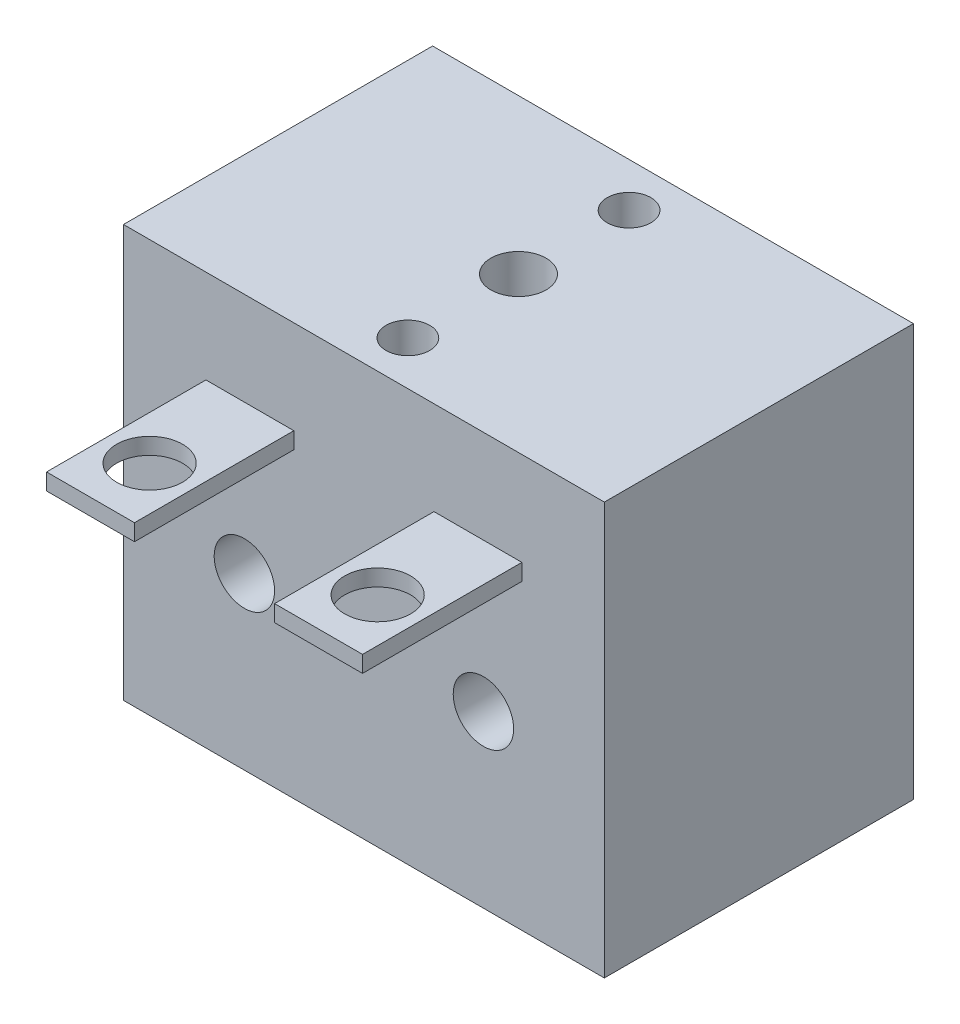
ISO-10303-21;
HEADER;
FILE_DESCRIPTION(('STEP AP214'),'2;1');
FILE_NAME('part.step','',(''),(''),'','','');
FILE_SCHEMA(('AUTOMOTIVE_DESIGN { 1 0 10303 214 1 1 1 1 }'));
ENDSEC;
DATA;
#1=APPLICATION_CONTEXT('core data for automotive mechanical design processes');
#2=APPLICATION_PROTOCOL_DEFINITION('international standard','automotive_design',2000,#1);
#3=PRODUCT_CONTEXT('',#1,'mechanical');
#4=PRODUCT('Part','Part','',(#3));
#5=PRODUCT_RELATED_PRODUCT_CATEGORY('part','',(#4));
#6=PRODUCT_DEFINITION_FORMATION('','',#4);
#7=PRODUCT_DEFINITION_CONTEXT('part definition',#1,'design');
#8=PRODUCT_DEFINITION('design','',#6,#7);
#9=PRODUCT_DEFINITION_SHAPE('','',#8);
#10=(LENGTH_UNIT() NAMED_UNIT(*) SI_UNIT(.MILLI.,.METRE.));
#11=(NAMED_UNIT(*) PLANE_ANGLE_UNIT() SI_UNIT($,.RADIAN.));
#12=(NAMED_UNIT(*) SI_UNIT($,.STERADIAN.) SOLID_ANGLE_UNIT());
#13=UNCERTAINTY_MEASURE_WITH_UNIT(LENGTH_MEASURE(1.E-05),#10,'distance_accuracy_value','');
#14=(GEOMETRIC_REPRESENTATION_CONTEXT(3) GLOBAL_UNCERTAINTY_ASSIGNED_CONTEXT((#13)) GLOBAL_UNIT_ASSIGNED_CONTEXT((#10,
#11,#12)) REPRESENTATION_CONTEXT('',''));
#15=CARTESIAN_POINT('',(0.,0.,0.));
#16=DIRECTION('',(0.,0.,1.));
#17=DIRECTION('',(1.,0.,0.));
#18=AXIS2_PLACEMENT_3D('',#15,#16,#17);
#19=CARTESIAN_POINT('',(0.,38.1,0.));
#20=DIRECTION('',(0.,0.,-1.));
#21=DIRECTION('',(-1.,0.,0.));
#22=AXIS2_PLACEMENT_3D('',#19,#20,#21);
#23=PLANE('',#22);
#24=DIRECTION('',(0.,-1.,0.));
#25=VECTOR('',#24,1.);
#26=CARTESIAN_POINT('',(7.62,29.464,0.));
#27=LINE('',#26,#25);
#28=CARTESIAN_POINT('',(7.62,29.464,0.));
#29=VERTEX_POINT('',#28);
#30=CARTESIAN_POINT('',(7.62,27.94,0.));
#31=VERTEX_POINT('',#30);
#32=EDGE_CURVE('E145',#29,#31,#27,.T.);
#33=ORIENTED_EDGE('',*,*,#32,.F.);
#34=DIRECTION('',(-1.,0.,0.));
#35=VECTOR('',#34,1.);
#36=CARTESIAN_POINT('',(7.62,29.464,0.));
#37=LINE('',#36,#35);
#38=CARTESIAN_POINT('',(15.748,29.464,0.));
#39=VERTEX_POINT('',#38);
#40=EDGE_CURVE('E158',#39,#29,#37,.T.);
#41=ORIENTED_EDGE('',*,*,#40,.F.);
#42=DIRECTION('',(0.,1.,0.));
#43=VECTOR('',#42,1.);
#44=CARTESIAN_POINT('',(15.748,29.464,0.));
#45=LINE('',#44,#43);
#46=CARTESIAN_POINT('',(15.748,27.94,0.));
#47=VERTEX_POINT('',#46);
#48=EDGE_CURVE('E167',#47,#39,#45,.T.);
#49=ORIENTED_EDGE('',*,*,#48,.F.);
#50=DIRECTION('',(1.,0.,0.));
#51=VECTOR('',#50,1.);
#52=CARTESIAN_POINT('',(7.62,27.94,0.));
#53=LINE('',#52,#51);
#54=EDGE_CURVE('E148',#31,#47,#53,.T.);
#55=ORIENTED_EDGE('',*,*,#54,.F.);
#56=EDGE_LOOP('',(#33,#41,#49,#55));
#57=FACE_BOUND('',#56,.T.);
#58=CARTESIAN_POINT('',(11.176,15.748,0.));
#59=DIRECTION('',(0.,0.,-1.));
#60=DIRECTION('',(-1.,0.,0.));
#61=AXIS2_PLACEMENT_3D('',#58,#59,#60);
#62=CIRCLE('',#61,2.794);
#63=CARTESIAN_POINT('',(8.382,15.748,0.));
#64=VERTEX_POINT('',#63);
#65=EDGE_CURVE('E184',#64,#64,#62,.T.);
#66=ORIENTED_EDGE('',*,*,#65,.T.);
#67=EDGE_LOOP('',(#66));
#68=FACE_BOUND('',#67,.T.);
#69=CARTESIAN_POINT('',(33.274,15.748,0.));
#70=DIRECTION('',(0.,0.,-1.));
#71=DIRECTION('',(-1.,0.,0.));
#72=AXIS2_PLACEMENT_3D('',#69,#70,#71);
#73=CIRCLE('',#72,2.794);
#74=CARTESIAN_POINT('',(30.48,15.748,0.));
#75=VERTEX_POINT('',#74);
#76=EDGE_CURVE('E190',#75,#75,#73,.T.);
#77=ORIENTED_EDGE('',*,*,#76,.T.);
#78=EDGE_LOOP('',(#77));
#79=FACE_BOUND('',#78,.T.);
#80=DIRECTION('',(1.,0.,0.));
#81=VECTOR('',#80,1.);
#82=CARTESIAN_POINT('',(0.,0.,0.));
#83=LINE('',#82,#81);
#84=CARTESIAN_POINT('',(0.,0.,0.));
#85=VERTEX_POINT('',#84);
#86=CARTESIAN_POINT('',(44.45,0.,0.));
#87=VERTEX_POINT('',#86);
#88=EDGE_CURVE('E227',#85,#87,#83,.T.);
#89=ORIENTED_EDGE('',*,*,#88,.T.);
#90=DIRECTION('',(0.,-1.,0.));
#91=VECTOR('',#90,1.);
#92=CARTESIAN_POINT('',(44.45,38.1,0.));
#93=LINE('',#92,#91);
#94=CARTESIAN_POINT('',(44.45,38.1,0.));
#95=VERTEX_POINT('',#94);
#96=EDGE_CURVE('E43',#95,#87,#93,.T.);
#97=ORIENTED_EDGE('',*,*,#96,.F.);
#98=DIRECTION('',(1.,0.,0.));
#99=VECTOR('',#98,1.);
#100=CARTESIAN_POINT('',(0.,38.1,0.));
#101=LINE('',#100,#99);
#102=CARTESIAN_POINT('',(0.,38.1,0.));
#103=VERTEX_POINT('',#102);
#104=EDGE_CURVE('E217',#103,#95,#101,.T.);
#105=ORIENTED_EDGE('',*,*,#104,.F.);
#106=DIRECTION('',(0.,-1.,0.));
#107=VECTOR('',#106,1.);
#108=CARTESIAN_POINT('',(0.,38.1,0.));
#109=LINE('',#108,#107);
#110=EDGE_CURVE('E11',#103,#85,#109,.T.);
#111=ORIENTED_EDGE('',*,*,#110,.T.);
#112=EDGE_LOOP('',(#89,#97,#105,#111));
#113=FACE_BOUND('',#112,.T.);
#114=DIRECTION('',(0.,-1.,0.));
#115=VECTOR('',#114,1.);
#116=CARTESIAN_POINT('',(28.702,29.464,0.));
#117=LINE('',#116,#115);
#118=CARTESIAN_POINT('',(28.702,29.464,0.));
#119=VERTEX_POINT('',#118);
#120=CARTESIAN_POINT('',(28.702,27.94,0.));
#121=VERTEX_POINT('',#120);
#122=EDGE_CURVE('E144',#119,#121,#117,.T.);
#123=ORIENTED_EDGE('',*,*,#122,.F.);
#124=DIRECTION('',(-1.,0.,0.));
#125=VECTOR('',#124,1.);
#126=CARTESIAN_POINT('',(28.702,29.464,0.));
#127=LINE('',#126,#125);
#128=CARTESIAN_POINT('',(36.83,29.464,0.));
#129=VERTEX_POINT('',#128);
#130=EDGE_CURVE('E141',#129,#119,#127,.T.);
#131=ORIENTED_EDGE('',*,*,#130,.F.);
#132=DIRECTION('',(0.,1.,0.));
#133=VECTOR('',#132,1.);
#134=CARTESIAN_POINT('',(36.83,29.464,0.));
#135=LINE('',#134,#133);
#136=CARTESIAN_POINT('',(36.83,27.94,0.));
#137=VERTEX_POINT('',#136);
#138=EDGE_CURVE('E55',#137,#129,#135,.T.);
#139=ORIENTED_EDGE('',*,*,#138,.F.);
#140=DIRECTION('',(1.,0.,0.));
#141=VECTOR('',#140,1.);
#142=CARTESIAN_POINT('',(28.702,27.94,0.));
#143=LINE('',#142,#141);
#144=EDGE_CURVE('E50',#121,#137,#143,.T.);
#145=ORIENTED_EDGE('',*,*,#144,.F.);
#146=EDGE_LOOP('',(#123,#131,#139,#145));
#147=FACE_BOUND('',#146,.T.);
#148=ADVANCED_FACE('F35',(#57,#68,#79,#113,#147),#23,.F.);
#149=CARTESIAN_POINT('',(0.,38.1,0.));
#150=DIRECTION('',(1.,0.,0.));
#151=DIRECTION('',(0.,0.,-1.));
#152=AXIS2_PLACEMENT_3D('',#149,#150,#151);
#153=PLANE('',#152);
#154=DIRECTION('',(0.,0.,1.));
#155=VECTOR('',#154,1.);
#156=CARTESIAN_POINT('',(0.,0.,0.));
#157=LINE('',#156,#155);
#158=CARTESIAN_POINT('',(0.,0.,-28.575));
#159=VERTEX_POINT('',#158);
#160=EDGE_CURVE('E211',#159,#85,#157,.T.);
#161=ORIENTED_EDGE('',*,*,#160,.T.);
#162=ORIENTED_EDGE('',*,*,#110,.F.);
#163=DIRECTION('',(0.,0.,1.));
#164=VECTOR('',#163,1.);
#165=CARTESIAN_POINT('',(0.,38.1,0.));
#166=LINE('',#165,#164);
#167=CARTESIAN_POINT('',(0.,38.1,-28.575));
#168=VERTEX_POINT('',#167);
#169=EDGE_CURVE('E214',#168,#103,#166,.T.);
#170=ORIENTED_EDGE('',*,*,#169,.F.);
#171=DIRECTION('',(0.,-1.,0.));
#172=VECTOR('',#171,1.);
#173=CARTESIAN_POINT('',(0.,38.1,-28.575));
#174=LINE('',#173,#172);
#175=EDGE_CURVE('E224',#168,#159,#174,.T.);
#176=ORIENTED_EDGE('',*,*,#175,.T.);
#177=EDGE_LOOP('',(#161,#162,#170,#176));
#178=FACE_BOUND('',#177,.T.);
#179=ADVANCED_FACE('F37',(#178),#153,.F.);
#180=CARTESIAN_POINT('',(44.45,38.1,0.));
#181=DIRECTION('',(-1.,0.,0.));
#182=DIRECTION('',(0.,0.,1.));
#183=AXIS2_PLACEMENT_3D('',#180,#181,#182);
#184=PLANE('',#183);
#185=DIRECTION('',(0.,0.,-1.));
#186=VECTOR('',#185,1.);
#187=CARTESIAN_POINT('',(44.45,0.,0.));
#188=LINE('',#187,#186);
#189=CARTESIAN_POINT('',(44.45,0.,-28.575));
#190=VERTEX_POINT('',#189);
#191=EDGE_CURVE('E229',#87,#190,#188,.T.);
#192=ORIENTED_EDGE('',*,*,#191,.T.);
#193=DIRECTION('',(0.,-1.,0.));
#194=VECTOR('',#193,1.);
#195=CARTESIAN_POINT('',(44.45,38.1,-28.575));
#196=LINE('',#195,#194);
#197=CARTESIAN_POINT('',(44.45,38.1,-28.575));
#198=VERTEX_POINT('',#197);
#199=EDGE_CURVE('E234',#198,#190,#196,.T.);
#200=ORIENTED_EDGE('',*,*,#199,.F.);
#201=DIRECTION('',(0.,0.,-1.));
#202=VECTOR('',#201,1.);
#203=CARTESIAN_POINT('',(44.45,38.1,0.));
#204=LINE('',#203,#202);
#205=EDGE_CURVE('E220',#95,#198,#204,.T.);
#206=ORIENTED_EDGE('',*,*,#205,.F.);
#207=ORIENTED_EDGE('',*,*,#96,.T.);
#208=EDGE_LOOP('',(#192,#200,#206,#207));
#209=FACE_BOUND('',#208,.T.);
#210=ADVANCED_FACE('F241',(#209),#184,.F.);
#211=CARTESIAN_POINT('',(0.,38.1,-28.575));
#212=DIRECTION('',(0.,0.,1.));
#213=DIRECTION('',(1.,0.,0.));
#214=AXIS2_PLACEMENT_3D('',#211,#212,#213);
#215=PLANE('',#214);
#216=CARTESIAN_POINT('',(11.176,15.748,-28.575));
#217=DIRECTION('',(0.,0.,-1.));
#218=DIRECTION('',(-1.,0.,0.));
#219=AXIS2_PLACEMENT_3D('',#216,#217,#218);
#220=CIRCLE('',#219,2.794);
#221=CARTESIAN_POINT('',(8.382,15.748,-28.575));
#222=VERTEX_POINT('',#221);
#223=EDGE_CURVE('E183',#222,#222,#220,.T.);
#224=ORIENTED_EDGE('',*,*,#223,.F.);
#225=EDGE_LOOP('',(#224));
#226=FACE_BOUND('',#225,.T.);
#227=CARTESIAN_POINT('',(33.274,15.748,-28.575));
#228=DIRECTION('',(0.,0.,-1.));
#229=DIRECTION('',(-1.,0.,0.));
#230=AXIS2_PLACEMENT_3D('',#227,#228,#229);
#231=CIRCLE('',#230,2.794);
#232=CARTESIAN_POINT('',(30.48,15.748,-28.575));
#233=VERTEX_POINT('',#232);
#234=EDGE_CURVE('E187',#233,#233,#231,.T.);
#235=ORIENTED_EDGE('',*,*,#234,.F.);
#236=EDGE_LOOP('',(#235));
#237=FACE_BOUND('',#236,.T.);
#238=DIRECTION('',(-1.,0.,0.));
#239=VECTOR('',#238,1.);
#240=CARTESIAN_POINT('',(0.,0.,-28.575));
#241=LINE('',#240,#239);
#242=EDGE_CURVE('E218',#190,#159,#241,.T.);
#243=ORIENTED_EDGE('',*,*,#242,.T.);
#244=ORIENTED_EDGE('',*,*,#175,.F.);
#245=DIRECTION('',(-1.,0.,0.));
#246=VECTOR('',#245,1.);
#247=CARTESIAN_POINT('',(0.,38.1,-28.575));
#248=LINE('',#247,#246);
#249=EDGE_CURVE('E222',#198,#168,#248,.T.);
#250=ORIENTED_EDGE('',*,*,#249,.F.);
#251=ORIENTED_EDGE('',*,*,#199,.T.);
#252=EDGE_LOOP('',(#243,#244,#250,#251));
#253=FACE_BOUND('',#252,.T.);
#254=ADVANCED_FACE('F250',(#226,#237,#253),#215,.F.);
#255=CARTESIAN_POINT('',(0.,38.1,-28.575));
#256=DIRECTION('',(0.,-1.,0.));
#257=DIRECTION('',(0.,0.,-1.));
#258=AXIS2_PLACEMENT_3D('',#255,#256,#257);
#259=PLANE('',#258);
#260=CARTESIAN_POINT('',(22.225,38.1,-4.064));
#261=DIRECTION('',(0.,1.,0.));
#262=DIRECTION('',(0.,0.,1.));
#263=AXIS2_PLACEMENT_3D('',#260,#261,#262);
#264=CIRCLE('',#263,2.0193);
#265=CARTESIAN_POINT('',(22.225,38.1,-2.0447));
#266=VERTEX_POINT('',#265);
#267=EDGE_CURVE('E193',#266,#266,#264,.T.);
#268=ORIENTED_EDGE('',*,*,#267,.F.);
#269=EDGE_LOOP('',(#268));
#270=FACE_BOUND('',#269,.T.);
#271=CARTESIAN_POINT('',(22.225,38.1,-24.511));
#272=DIRECTION('',(0.,1.,0.));
#273=DIRECTION('',(0.,0.,1.));
#274=AXIS2_PLACEMENT_3D('',#271,#272,#273);
#275=CIRCLE('',#274,2.0193);
#276=CARTESIAN_POINT('',(22.225,38.1,-22.4917));
#277=VERTEX_POINT('',#276);
#278=EDGE_CURVE('E199',#277,#277,#275,.T.);
#279=ORIENTED_EDGE('',*,*,#278,.F.);
#280=EDGE_LOOP('',(#279));
#281=FACE_BOUND('',#280,.T.);
#282=CARTESIAN_POINT('',(22.225,38.1,-14.2875));
#283=DIRECTION('',(0.,1.,0.));
#284=DIRECTION('',(0.,0.,1.));
#285=AXIS2_PLACEMENT_3D('',#282,#283,#284);
#286=CIRCLE('',#285,2.5527);
#287=CARTESIAN_POINT('',(22.225,38.1,-11.7348));
#288=VERTEX_POINT('',#287);
#289=EDGE_CURVE('E205',#288,#288,#286,.T.);
#290=ORIENTED_EDGE('',*,*,#289,.F.);
#291=EDGE_LOOP('',(#290));
#292=FACE_BOUND('',#291,.T.);
#293=ORIENTED_EDGE('',*,*,#169,.T.);
#294=ORIENTED_EDGE('',*,*,#104,.T.);
#295=ORIENTED_EDGE('',*,*,#205,.T.);
#296=ORIENTED_EDGE('',*,*,#249,.T.);
#297=EDGE_LOOP('',(#293,#294,#295,#296));
#298=FACE_BOUND('',#297,.T.);
#299=ADVANCED_FACE('F256',(#270,#281,#292,#298),#259,.F.);
#300=CARTESIAN_POINT('',(0.,0.,-28.575));
#301=DIRECTION('',(0.,-1.,0.));
#302=DIRECTION('',(0.,0.,-1.));
#303=AXIS2_PLACEMENT_3D('',#300,#301,#302);
#304=PLANE('',#303);
#305=CARTESIAN_POINT('',(22.225,0.,-4.064));
#306=DIRECTION('',(0.,1.,0.));
#307=DIRECTION('',(0.,0.,1.));
#308=AXIS2_PLACEMENT_3D('',#305,#306,#307);
#309=CIRCLE('',#308,2.0193);
#310=CARTESIAN_POINT('',(22.225,0.,-2.0447));
#311=VERTEX_POINT('',#310);
#312=EDGE_CURVE('E196',#311,#311,#309,.T.);
#313=ORIENTED_EDGE('',*,*,#312,.T.);
#314=EDGE_LOOP('',(#313));
#315=FACE_BOUND('',#314,.T.);
#316=CARTESIAN_POINT('',(22.225,0.,-24.511));
#317=DIRECTION('',(0.,1.,0.));
#318=DIRECTION('',(0.,0.,1.));
#319=AXIS2_PLACEMENT_3D('',#316,#317,#318);
#320=CIRCLE('',#319,2.0193);
#321=CARTESIAN_POINT('',(22.225,0.,-22.4917));
#322=VERTEX_POINT('',#321);
#323=EDGE_CURVE('E202',#322,#322,#320,.T.);
#324=ORIENTED_EDGE('',*,*,#323,.T.);
#325=EDGE_LOOP('',(#324));
#326=FACE_BOUND('',#325,.T.);
#327=CARTESIAN_POINT('',(22.225,0.,-14.2875));
#328=DIRECTION('',(0.,1.,0.));
#329=DIRECTION('',(0.,0.,1.));
#330=AXIS2_PLACEMENT_3D('',#327,#328,#329);
#331=CIRCLE('',#330,2.5527);
#332=CARTESIAN_POINT('',(22.225,0.,-11.7348));
#333=VERTEX_POINT('',#332);
#334=EDGE_CURVE('E208',#333,#333,#331,.T.);
#335=ORIENTED_EDGE('',*,*,#334,.T.);
#336=EDGE_LOOP('',(#335));
#337=FACE_BOUND('',#336,.T.);
#338=ORIENTED_EDGE('',*,*,#160,.F.);
#339=ORIENTED_EDGE('',*,*,#242,.F.);
#340=ORIENTED_EDGE('',*,*,#191,.F.);
#341=ORIENTED_EDGE('',*,*,#88,.F.);
#342=EDGE_LOOP('',(#338,#339,#340,#341));
#343=FACE_BOUND('',#342,.T.);
#344=ADVANCED_FACE('F247',(#315,#326,#337,#343),#304,.T.);
#345=CARTESIAN_POINT('',(22.225,0.,-14.2875));
#346=DIRECTION('',(0.,1.,0.));
#347=DIRECTION('',(0.,0.,1.));
#348=AXIS2_PLACEMENT_3D('',#345,#346,#347);
#349=CYLINDRICAL_SURFACE('',#348,2.5527);
#350=CARTESIAN_POINT('',(22.225,0.,-11.7348));
#351=CARTESIAN_POINT('',(22.225,0.396875,-11.7348));
#352=CARTESIAN_POINT('',(22.225,0.79375,-11.7348));
#353=CARTESIAN_POINT('',(22.225,1.5875,-11.7348));
#354=CARTESIAN_POINT('',(22.225,1.984375,-11.7348));
#355=CARTESIAN_POINT('',(22.225,2.778125,-11.7348));
#356=CARTESIAN_POINT('',(22.225,3.175,-11.7348));
#357=CARTESIAN_POINT('',(22.225,3.96875,-11.7348));
#358=CARTESIAN_POINT('',(22.225,4.365625,-11.7348));
#359=CARTESIAN_POINT('',(22.225,5.159375,-11.7348));
#360=CARTESIAN_POINT('',(22.225,5.55625,-11.7348));
#361=CARTESIAN_POINT('',(22.225,6.35,-11.7348));
#362=CARTESIAN_POINT('',(22.225,6.746875,-11.7348));
#363=CARTESIAN_POINT('',(22.225,7.540625,-11.7348));
#364=CARTESIAN_POINT('',(22.225,7.9375,-11.7348));
#365=CARTESIAN_POINT('',(22.225,8.73125,-11.7348));
#366=CARTESIAN_POINT('',(22.225,9.128125,-11.7348));
#367=CARTESIAN_POINT('',(22.225,9.921875,-11.7348));
#368=CARTESIAN_POINT('',(22.225,10.31875,-11.7348));
#369=CARTESIAN_POINT('',(22.225,11.1125,-11.7348));
#370=CARTESIAN_POINT('',(22.225,11.509375,-11.7348));
#371=CARTESIAN_POINT('',(22.225,12.303125,-11.7348));
#372=CARTESIAN_POINT('',(22.225,12.7,-11.7348));
#373=CARTESIAN_POINT('',(22.225,13.49375,-11.7348));
#374=CARTESIAN_POINT('',(22.225,13.890625,-11.7348));
#375=CARTESIAN_POINT('',(22.225,14.684375,-11.7348));
#376=CARTESIAN_POINT('',(22.225,15.08125,-11.7348));
#377=CARTESIAN_POINT('',(22.225,15.875,-11.7348));
#378=CARTESIAN_POINT('',(22.225,16.271875,-11.7348));
#379=CARTESIAN_POINT('',(22.225,17.065625,-11.7348));
#380=CARTESIAN_POINT('',(22.225,17.4625,-11.7348));
#381=CARTESIAN_POINT('',(22.225,18.25625,-11.7348));
#382=CARTESIAN_POINT('',(22.225,18.653125,-11.7348));
#383=CARTESIAN_POINT('',(22.225,19.446875,-11.7348));
#384=CARTESIAN_POINT('',(22.225,19.84375,-11.7348));
#385=CARTESIAN_POINT('',(22.225,20.6375,-11.7348));
#386=CARTESIAN_POINT('',(22.225,21.034375,-11.7348));
#387=CARTESIAN_POINT('',(22.225,21.828125,-11.7348));
#388=CARTESIAN_POINT('',(22.225,22.225,-11.7348));
#389=CARTESIAN_POINT('',(22.225,23.01875,-11.7348));
#390=CARTESIAN_POINT('',(22.225,23.415625,-11.7348));
#391=CARTESIAN_POINT('',(22.225,24.209375,-11.7348));
#392=CARTESIAN_POINT('',(22.225,24.60625,-11.7348));
#393=CARTESIAN_POINT('',(22.225,25.4,-11.7348));
#394=CARTESIAN_POINT('',(22.225,25.796875,-11.7348));
#395=CARTESIAN_POINT('',(22.225,26.590625,-11.7348));
#396=CARTESIAN_POINT('',(22.225,26.9875,-11.7348));
#397=CARTESIAN_POINT('',(22.225,27.78125,-11.7348));
#398=CARTESIAN_POINT('',(22.225,28.178125,-11.7348));
#399=CARTESIAN_POINT('',(22.225,28.971875,-11.7348));
#400=CARTESIAN_POINT('',(22.225,29.36875,-11.7348));
#401=CARTESIAN_POINT('',(22.225,30.1625,-11.7348));
#402=CARTESIAN_POINT('',(22.225,30.559375,-11.7348));
#403=CARTESIAN_POINT('',(22.225,31.353125,-11.7348));
#404=CARTESIAN_POINT('',(22.225,31.75,-11.7348));
#405=CARTESIAN_POINT('',(22.225,32.54375,-11.7348));
#406=CARTESIAN_POINT('',(22.225,32.940625,-11.7348));
#407=CARTESIAN_POINT('',(22.225,33.734375,-11.7348));
#408=CARTESIAN_POINT('',(22.225,34.13125,-11.7348));
#409=CARTESIAN_POINT('',(22.225,34.925,-11.7348));
#410=CARTESIAN_POINT('',(22.225,35.321875,-11.7348));
#411=CARTESIAN_POINT('',(22.225,36.115625,-11.7348));
#412=CARTESIAN_POINT('',(22.225,36.5125,-11.7348));
#413=CARTESIAN_POINT('',(22.225,37.30625,-11.7348));
#414=CARTESIAN_POINT('',(22.225,37.703125,-11.7348));
#415=CARTESIAN_POINT('',(22.225,38.1,-11.7348));
#416=B_SPLINE_CURVE_WITH_KNOTS('',3,(#350,#351,#352,#353,#354,#355,#356,#357,#358,#359,#360,
#361,#362,#363,#364,#365,#366,#367,#368,#369,#370,#371,#372,#373,#374,#375,#376,#377,#378,#379,
#380,#381,#382,#383,#384,#385,#386,#387,#388,#389,#390,#391,#392,#393,#394,#395,#396,#397,#398,
#399,#400,#401,#402,#403,#404,#405,#406,#407,#408,#409,#410,#411,#412,#413,#414,#415),
.UNSPECIFIED.,.F.,.F.,(4,2,2,2,2,2,2,2,2,2,2,2,2,2,2,2,2,2,2,2,2,2,2,2,2,2,2,2,2,2,2,2,4),(0.,
1.190625,2.38125,3.571875,4.7625,5.953125,7.14375,8.334375,9.525,10.715625,11.90625,13.096875,
14.2875,15.478125,16.66875,17.859375,19.05,20.240625,21.43125,22.621875,23.8125,25.003125,
26.19375,27.384375,28.575,29.765625,30.95625,32.146875,33.3375,34.528125,35.71875,36.909375,
38.1),.UNSPECIFIED.);
#417=EDGE_CURVE('BSEAM342',#333,#288,#416,.T.);
#418=ORIENTED_EDGE('',*,*,#334,.F.);
#419=ORIENTED_EDGE('',*,*,#289,.T.);
#420=ORIENTED_EDGE('',*,*,#417,.T.);
#421=ORIENTED_EDGE('',*,*,#417,.F.);
#422=EDGE_LOOP('',(#418,#420,#419,#421));
#423=FACE_BOUND('',#422,.T.);
#424=ADVANCED_FACE('F342',(#423),#349,.F.);
#425=CARTESIAN_POINT('',(22.225,0.,-24.511));
#426=DIRECTION('',(0.,1.,0.));
#427=DIRECTION('',(0.,0.,1.));
#428=AXIS2_PLACEMENT_3D('',#425,#426,#427);
#429=CYLINDRICAL_SURFACE('',#428,2.0193);
#430=CARTESIAN_POINT('',(22.225,0.,-22.4917));
#431=CARTESIAN_POINT('',(22.225,0.396875,-22.4917));
#432=CARTESIAN_POINT('',(22.225,0.79375,-22.4917));
#433=CARTESIAN_POINT('',(22.225,1.5875,-22.4917));
#434=CARTESIAN_POINT('',(22.225,1.984375,-22.4917));
#435=CARTESIAN_POINT('',(22.225,2.778125,-22.4917));
#436=CARTESIAN_POINT('',(22.225,3.175,-22.4917));
#437=CARTESIAN_POINT('',(22.225,3.96875,-22.4917));
#438=CARTESIAN_POINT('',(22.225,4.365625,-22.4917));
#439=CARTESIAN_POINT('',(22.225,5.159375,-22.4917));
#440=CARTESIAN_POINT('',(22.225,5.55625,-22.4917));
#441=CARTESIAN_POINT('',(22.225,6.35,-22.4917));
#442=CARTESIAN_POINT('',(22.225,6.746875,-22.4917));
#443=CARTESIAN_POINT('',(22.225,7.540625,-22.4917));
#444=CARTESIAN_POINT('',(22.225,7.9375,-22.4917));
#445=CARTESIAN_POINT('',(22.225,8.73125,-22.4917));
#446=CARTESIAN_POINT('',(22.225,9.128125,-22.4917));
#447=CARTESIAN_POINT('',(22.225,9.921875,-22.4917));
#448=CARTESIAN_POINT('',(22.225,10.31875,-22.4917));
#449=CARTESIAN_POINT('',(22.225,11.1125,-22.4917));
#450=CARTESIAN_POINT('',(22.225,11.509375,-22.4917));
#451=CARTESIAN_POINT('',(22.225,12.303125,-22.4917));
#452=CARTESIAN_POINT('',(22.225,12.7,-22.4917));
#453=CARTESIAN_POINT('',(22.225,13.49375,-22.4917));
#454=CARTESIAN_POINT('',(22.225,13.890625,-22.4917));
#455=CARTESIAN_POINT('',(22.225,14.684375,-22.4917));
#456=CARTESIAN_POINT('',(22.225,15.08125,-22.4917));
#457=CARTESIAN_POINT('',(22.225,15.875,-22.4917));
#458=CARTESIAN_POINT('',(22.225,16.271875,-22.4917));
#459=CARTESIAN_POINT('',(22.225,17.065625,-22.4917));
#460=CARTESIAN_POINT('',(22.225,17.4625,-22.4917));
#461=CARTESIAN_POINT('',(22.225,18.25625,-22.4917));
#462=CARTESIAN_POINT('',(22.225,18.653125,-22.4917));
#463=CARTESIAN_POINT('',(22.225,19.446875,-22.4917));
#464=CARTESIAN_POINT('',(22.225,19.84375,-22.4917));
#465=CARTESIAN_POINT('',(22.225,20.6375,-22.4917));
#466=CARTESIAN_POINT('',(22.225,21.034375,-22.4917));
#467=CARTESIAN_POINT('',(22.225,21.828125,-22.4917));
#468=CARTESIAN_POINT('',(22.225,22.225,-22.4917));
#469=CARTESIAN_POINT('',(22.225,23.01875,-22.4917));
#470=CARTESIAN_POINT('',(22.225,23.415625,-22.4917));
#471=CARTESIAN_POINT('',(22.225,24.209375,-22.4917));
#472=CARTESIAN_POINT('',(22.225,24.60625,-22.4917));
#473=CARTESIAN_POINT('',(22.225,25.4,-22.4917));
#474=CARTESIAN_POINT('',(22.225,25.796875,-22.4917));
#475=CARTESIAN_POINT('',(22.225,26.590625,-22.4917));
#476=CARTESIAN_POINT('',(22.225,26.9875,-22.4917));
#477=CARTESIAN_POINT('',(22.225,27.78125,-22.4917));
#478=CARTESIAN_POINT('',(22.225,28.178125,-22.4917));
#479=CARTESIAN_POINT('',(22.225,28.971875,-22.4917));
#480=CARTESIAN_POINT('',(22.225,29.36875,-22.4917));
#481=CARTESIAN_POINT('',(22.225,30.1625,-22.4917));
#482=CARTESIAN_POINT('',(22.225,30.559375,-22.4917));
#483=CARTESIAN_POINT('',(22.225,31.353125,-22.4917));
#484=CARTESIAN_POINT('',(22.225,31.75,-22.4917));
#485=CARTESIAN_POINT('',(22.225,32.54375,-22.4917));
#486=CARTESIAN_POINT('',(22.225,32.940625,-22.4917));
#487=CARTESIAN_POINT('',(22.225,33.734375,-22.4917));
#488=CARTESIAN_POINT('',(22.225,34.13125,-22.4917));
#489=CARTESIAN_POINT('',(22.225,34.925,-22.4917));
#490=CARTESIAN_POINT('',(22.225,35.321875,-22.4917));
#491=CARTESIAN_POINT('',(22.225,36.115625,-22.4917));
#492=CARTESIAN_POINT('',(22.225,36.5125,-22.4917));
#493=CARTESIAN_POINT('',(22.225,37.30625,-22.4917));
#494=CARTESIAN_POINT('',(22.225,37.703125,-22.4917));
#495=CARTESIAN_POINT('',(22.225,38.1,-22.4917));
#496=B_SPLINE_CURVE_WITH_KNOTS('',3,(#430,#431,#432,#433,#434,#435,#436,#437,#438,#439,#440,
#441,#442,#443,#444,#445,#446,#447,#448,#449,#450,#451,#452,#453,#454,#455,#456,#457,#458,#459,
#460,#461,#462,#463,#464,#465,#466,#467,#468,#469,#470,#471,#472,#473,#474,#475,#476,#477,#478,
#479,#480,#481,#482,#483,#484,#485,#486,#487,#488,#489,#490,#491,#492,#493,#494,#495),
.UNSPECIFIED.,.F.,.F.,(4,2,2,2,2,2,2,2,2,2,2,2,2,2,2,2,2,2,2,2,2,2,2,2,2,2,2,2,2,2,2,2,4),(0.,
1.190625,2.38125,3.571875,4.7625,5.953125,7.14375,8.334375,9.525,10.715625,11.90625,13.096875,
14.2875,15.478125,16.66875,17.859375,19.05,20.240625,21.43125,22.621875,23.8125,25.003125,
26.19375,27.384375,28.575,29.765625,30.95625,32.146875,33.3375,34.528125,35.71875,36.909375,
38.1),.UNSPECIFIED.);
#497=EDGE_CURVE('BSEAM338',#322,#277,#496,.T.);
#498=ORIENTED_EDGE('',*,*,#323,.F.);
#499=ORIENTED_EDGE('',*,*,#278,.T.);
#500=ORIENTED_EDGE('',*,*,#497,.T.);
#501=ORIENTED_EDGE('',*,*,#497,.F.);
#502=EDGE_LOOP('',(#498,#500,#499,#501));
#503=FACE_BOUND('',#502,.T.);
#504=ADVANCED_FACE('F338',(#503),#429,.F.);
#505=CARTESIAN_POINT('',(22.225,0.,-4.064));
#506=DIRECTION('',(0.,1.,0.));
#507=DIRECTION('',(0.,0.,1.));
#508=AXIS2_PLACEMENT_3D('',#505,#506,#507);
#509=CYLINDRICAL_SURFACE('',#508,2.0193);
#510=CARTESIAN_POINT('',(22.225,0.,-2.0447));
#511=CARTESIAN_POINT('',(22.225,0.396875,-2.0447));
#512=CARTESIAN_POINT('',(22.225,0.79375,-2.0447));
#513=CARTESIAN_POINT('',(22.225,1.5875,-2.0447));
#514=CARTESIAN_POINT('',(22.225,1.984375,-2.0447));
#515=CARTESIAN_POINT('',(22.225,2.778125,-2.0447));
#516=CARTESIAN_POINT('',(22.225,3.175,-2.0447));
#517=CARTESIAN_POINT('',(22.225,3.96875,-2.0447));
#518=CARTESIAN_POINT('',(22.225,4.365625,-2.0447));
#519=CARTESIAN_POINT('',(22.225,5.159375,-2.0447));
#520=CARTESIAN_POINT('',(22.225,5.55625,-2.0447));
#521=CARTESIAN_POINT('',(22.225,6.35,-2.0447));
#522=CARTESIAN_POINT('',(22.225,6.746875,-2.0447));
#523=CARTESIAN_POINT('',(22.225,7.540625,-2.0447));
#524=CARTESIAN_POINT('',(22.225,7.9375,-2.0447));
#525=CARTESIAN_POINT('',(22.225,8.73125,-2.0447));
#526=CARTESIAN_POINT('',(22.225,9.128125,-2.0447));
#527=CARTESIAN_POINT('',(22.225,9.921875,-2.0447));
#528=CARTESIAN_POINT('',(22.225,10.31875,-2.0447));
#529=CARTESIAN_POINT('',(22.225,11.1125,-2.0447));
#530=CARTESIAN_POINT('',(22.225,11.509375,-2.0447));
#531=CARTESIAN_POINT('',(22.225,12.303125,-2.0447));
#532=CARTESIAN_POINT('',(22.225,12.7,-2.0447));
#533=CARTESIAN_POINT('',(22.225,13.49375,-2.0447));
#534=CARTESIAN_POINT('',(22.225,13.890625,-2.0447));
#535=CARTESIAN_POINT('',(22.225,14.684375,-2.0447));
#536=CARTESIAN_POINT('',(22.225,15.08125,-2.0447));
#537=CARTESIAN_POINT('',(22.225,15.875,-2.0447));
#538=CARTESIAN_POINT('',(22.225,16.271875,-2.0447));
#539=CARTESIAN_POINT('',(22.225,17.065625,-2.0447));
#540=CARTESIAN_POINT('',(22.225,17.4625,-2.0447));
#541=CARTESIAN_POINT('',(22.225,18.25625,-2.0447));
#542=CARTESIAN_POINT('',(22.225,18.653125,-2.0447));
#543=CARTESIAN_POINT('',(22.225,19.446875,-2.0447));
#544=CARTESIAN_POINT('',(22.225,19.84375,-2.0447));
#545=CARTESIAN_POINT('',(22.225,20.6375,-2.0447));
#546=CARTESIAN_POINT('',(22.225,21.034375,-2.0447));
#547=CARTESIAN_POINT('',(22.225,21.828125,-2.0447));
#548=CARTESIAN_POINT('',(22.225,22.225,-2.0447));
#549=CARTESIAN_POINT('',(22.225,23.01875,-2.0447));
#550=CARTESIAN_POINT('',(22.225,23.415625,-2.0447));
#551=CARTESIAN_POINT('',(22.225,24.209375,-2.0447));
#552=CARTESIAN_POINT('',(22.225,24.60625,-2.0447));
#553=CARTESIAN_POINT('',(22.225,25.4,-2.0447));
#554=CARTESIAN_POINT('',(22.225,25.796875,-2.0447));
#555=CARTESIAN_POINT('',(22.225,26.590625,-2.0447));
#556=CARTESIAN_POINT('',(22.225,26.9875,-2.0447));
#557=CARTESIAN_POINT('',(22.225,27.78125,-2.0447));
#558=CARTESIAN_POINT('',(22.225,28.178125,-2.0447));
#559=CARTESIAN_POINT('',(22.225,28.971875,-2.0447));
#560=CARTESIAN_POINT('',(22.225,29.36875,-2.0447));
#561=CARTESIAN_POINT('',(22.225,30.1625,-2.0447));
#562=CARTESIAN_POINT('',(22.225,30.559375,-2.0447));
#563=CARTESIAN_POINT('',(22.225,31.353125,-2.0447));
#564=CARTESIAN_POINT('',(22.225,31.75,-2.0447));
#565=CARTESIAN_POINT('',(22.225,32.54375,-2.0447));
#566=CARTESIAN_POINT('',(22.225,32.940625,-2.0447));
#567=CARTESIAN_POINT('',(22.225,33.734375,-2.0447));
#568=CARTESIAN_POINT('',(22.225,34.13125,-2.0447));
#569=CARTESIAN_POINT('',(22.225,34.925,-2.0447));
#570=CARTESIAN_POINT('',(22.225,35.321875,-2.0447));
#571=CARTESIAN_POINT('',(22.225,36.115625,-2.0447));
#572=CARTESIAN_POINT('',(22.225,36.5125,-2.0447));
#573=CARTESIAN_POINT('',(22.225,37.30625,-2.0447));
#574=CARTESIAN_POINT('',(22.225,37.703125,-2.0447));
#575=CARTESIAN_POINT('',(22.225,38.1,-2.0447));
#576=B_SPLINE_CURVE_WITH_KNOTS('',3,(#510,#511,#512,#513,#514,#515,#516,#517,#518,#519,#520,
#521,#522,#523,#524,#525,#526,#527,#528,#529,#530,#531,#532,#533,#534,#535,#536,#537,#538,#539,
#540,#541,#542,#543,#544,#545,#546,#547,#548,#549,#550,#551,#552,#553,#554,#555,#556,#557,#558,
#559,#560,#561,#562,#563,#564,#565,#566,#567,#568,#569,#570,#571,#572,#573,#574,#575),
.UNSPECIFIED.,.F.,.F.,(4,2,2,2,2,2,2,2,2,2,2,2,2,2,2,2,2,2,2,2,2,2,2,2,2,2,2,2,2,2,2,2,4),(0.,
1.190625,2.38125,3.571875,4.7625,5.953125,7.14375,8.334375,9.525,10.715625,11.90625,13.096875,
14.2875,15.478125,16.66875,17.859375,19.05,20.240625,21.43125,22.621875,23.8125,25.003125,
26.19375,27.384375,28.575,29.765625,30.95625,32.146875,33.3375,34.528125,35.71875,36.909375,
38.1),.UNSPECIFIED.);
#577=EDGE_CURVE('BSEAM334',#311,#266,#576,.T.);
#578=ORIENTED_EDGE('',*,*,#312,.F.);
#579=ORIENTED_EDGE('',*,*,#267,.T.);
#580=ORIENTED_EDGE('',*,*,#577,.T.);
#581=ORIENTED_EDGE('',*,*,#577,.F.);
#582=EDGE_LOOP('',(#578,#580,#579,#581));
#583=FACE_BOUND('',#582,.T.);
#584=ADVANCED_FACE('F334',(#583),#509,.F.);
#585=CARTESIAN_POINT('',(33.274,15.748,0.));
#586=DIRECTION('',(0.,0.,-1.));
#587=DIRECTION('',(-1.,0.,0.));
#588=AXIS2_PLACEMENT_3D('',#585,#586,#587);
#589=CYLINDRICAL_SURFACE('',#588,2.794);
#590=ORIENTED_EDGE('',*,*,#76,.F.);
#591=EDGE_LOOP('',(#590));
#592=FACE_BOUND('',#591,.T.);
#593=ORIENTED_EDGE('',*,*,#234,.T.);
#594=EDGE_LOOP('',(#593));
#595=FACE_BOUND('',#594,.T.);
#596=ADVANCED_FACE('F330',(#592,#595),#589,.F.);
#597=CARTESIAN_POINT('',(11.176,15.748,0.));
#598=DIRECTION('',(0.,0.,-1.));
#599=DIRECTION('',(-1.,0.,0.));
#600=AXIS2_PLACEMENT_3D('',#597,#598,#599);
#601=CYLINDRICAL_SURFACE('',#600,2.794);
#602=ORIENTED_EDGE('',*,*,#65,.F.);
#603=EDGE_LOOP('',(#602));
#604=FACE_BOUND('',#603,.T.);
#605=ORIENTED_EDGE('',*,*,#223,.T.);
#606=EDGE_LOOP('',(#605));
#607=FACE_BOUND('',#606,.T.);
#608=ADVANCED_FACE('F326',(#604,#607),#601,.F.);
#609=CARTESIAN_POINT('',(7.62,29.464,14.732));
#610=DIRECTION('',(1.,0.,0.));
#611=DIRECTION('',(0.,0.,-1.));
#612=AXIS2_PLACEMENT_3D('',#609,#610,#611);
#613=PLANE('',#612);
#614=ORIENTED_EDGE('',*,*,#32,.T.);
#615=DIRECTION('',(0.,0.,-1.));
#616=VECTOR('',#615,1.);
#617=CARTESIAN_POINT('',(7.62,27.94,14.732));
#618=LINE('',#617,#616);
#619=CARTESIAN_POINT('',(7.62,27.94,14.732));
#620=VERTEX_POINT('',#619);
#621=EDGE_CURVE('E180',#620,#31,#618,.T.);
#622=ORIENTED_EDGE('',*,*,#621,.F.);
#623=DIRECTION('',(0.,-1.,0.));
#624=VECTOR('',#623,1.);
#625=CARTESIAN_POINT('',(7.62,29.464,14.732));
#626=LINE('',#625,#624);
#627=CARTESIAN_POINT('',(7.62,29.464,14.732));
#628=VERTEX_POINT('',#627);
#629=EDGE_CURVE('E154',#628,#620,#626,.T.);
#630=ORIENTED_EDGE('',*,*,#629,.F.);
#631=DIRECTION('',(0.,0.,-1.));
#632=VECTOR('',#631,1.);
#633=CARTESIAN_POINT('',(7.62,29.464,14.732));
#634=LINE('',#633,#632);
#635=EDGE_CURVE('E163',#628,#29,#634,.T.);
#636=ORIENTED_EDGE('',*,*,#635,.T.);
#637=EDGE_LOOP('',(#614,#622,#630,#636));
#638=FACE_BOUND('',#637,.T.);
#639=ADVANCED_FACE('F322',(#638),#613,.F.);
#640=CARTESIAN_POINT('',(7.62,27.94,14.732));
#641=DIRECTION('',(0.,1.,0.));
#642=DIRECTION('',(0.,0.,1.));
#643=AXIS2_PLACEMENT_3D('',#640,#641,#642);
#644=PLANE('',#643);
#645=CARTESIAN_POINT('',(11.684,27.94,9.271));
#646=DIRECTION('',(0.,1.,0.));
#647=DIRECTION('',(0.,0.,1.));
#648=AXIS2_PLACEMENT_3D('',#645,#646,#647);
#649=CIRCLE('',#648,3.048);
#650=CARTESIAN_POINT('',(11.684,27.94,12.319));
#651=VERTEX_POINT('',#650);
#652=EDGE_CURVE('E260',#651,#651,#649,.T.);
#653=ORIENTED_EDGE('',*,*,#652,.T.);
#654=EDGE_LOOP('',(#653));
#655=FACE_BOUND('',#654,.T.);
#656=ORIENTED_EDGE('',*,*,#54,.T.);
#657=DIRECTION('',(0.,0.,-1.));
#658=VECTOR('',#657,1.);
#659=CARTESIAN_POINT('',(15.748,27.94,14.732));
#660=LINE('',#659,#658);
#661=CARTESIAN_POINT('',(15.748,27.94,14.732));
#662=VERTEX_POINT('',#661);
#663=EDGE_CURVE('E177',#662,#47,#660,.T.);
#664=ORIENTED_EDGE('',*,*,#663,.F.);
#665=DIRECTION('',(1.,0.,0.));
#666=VECTOR('',#665,1.);
#667=CARTESIAN_POINT('',(7.62,27.94,14.732));
#668=LINE('',#667,#666);
#669=EDGE_CURVE('E157',#620,#662,#668,.T.);
#670=ORIENTED_EDGE('',*,*,#669,.F.);
#671=ORIENTED_EDGE('',*,*,#621,.T.);
#672=EDGE_LOOP('',(#656,#664,#670,#671));
#673=FACE_BOUND('',#672,.T.);
#674=ADVANCED_FACE('F318',(#655,#673),#644,.F.);
#675=CARTESIAN_POINT('',(15.748,29.464,14.732));
#676=DIRECTION('',(-1.,0.,0.));
#677=DIRECTION('',(0.,0.,1.));
#678=AXIS2_PLACEMENT_3D('',#675,#676,#677);
#679=PLANE('',#678);
#680=ORIENTED_EDGE('',*,*,#48,.T.);
#681=DIRECTION('',(0.,0.,-1.));
#682=VECTOR('',#681,1.);
#683=CARTESIAN_POINT('',(15.748,29.464,14.732));
#684=LINE('',#683,#682);
#685=CARTESIAN_POINT('',(15.748,29.464,14.732));
#686=VERTEX_POINT('',#685);
#687=EDGE_CURVE('E174',#686,#39,#684,.T.);
#688=ORIENTED_EDGE('',*,*,#687,.F.);
#689=DIRECTION('',(0.,1.,0.));
#690=VECTOR('',#689,1.);
#691=CARTESIAN_POINT('',(15.748,29.464,14.732));
#692=LINE('',#691,#690);
#693=EDGE_CURVE('E160',#662,#686,#692,.T.);
#694=ORIENTED_EDGE('',*,*,#693,.F.);
#695=ORIENTED_EDGE('',*,*,#663,.T.);
#696=EDGE_LOOP('',(#680,#688,#694,#695));
#697=FACE_BOUND('',#696,.T.);
#698=ADVANCED_FACE('F314',(#697),#679,.F.);
#699=CARTESIAN_POINT('',(7.62,29.464,14.732));
#700=DIRECTION('',(0.,-1.,0.));
#701=DIRECTION('',(0.,0.,-1.));
#702=AXIS2_PLACEMENT_3D('',#699,#700,#701);
#703=PLANE('',#702);
#704=CARTESIAN_POINT('',(11.684,29.464,9.271));
#705=DIRECTION('',(0.,1.,0.));
#706=DIRECTION('',(0.,0.,1.));
#707=AXIS2_PLACEMENT_3D('',#704,#705,#706);
#708=CIRCLE('',#707,3.048);
#709=CARTESIAN_POINT('',(11.684,29.464,12.319));
#710=VERTEX_POINT('',#709);
#711=EDGE_CURVE('E276',#710,#710,#708,.T.);
#712=ORIENTED_EDGE('',*,*,#711,.F.);
#713=EDGE_LOOP('',(#712));
#714=FACE_BOUND('',#713,.T.);
#715=ORIENTED_EDGE('',*,*,#40,.T.);
#716=ORIENTED_EDGE('',*,*,#635,.F.);
#717=DIRECTION('',(-1.,0.,0.));
#718=VECTOR('',#717,1.);
#719=CARTESIAN_POINT('',(7.62,29.464,14.732));
#720=LINE('',#719,#718);
#721=EDGE_CURVE('E162',#686,#628,#720,.T.);
#722=ORIENTED_EDGE('',*,*,#721,.F.);
#723=ORIENTED_EDGE('',*,*,#687,.T.);
#724=EDGE_LOOP('',(#715,#716,#722,#723));
#725=FACE_BOUND('',#724,.T.);
#726=ADVANCED_FACE('F310',(#714,#725),#703,.F.);
#727=CARTESIAN_POINT('',(7.62,27.94,14.732));
#728=DIRECTION('',(0.,0.,1.));
#729=DIRECTION('',(1.,0.,0.));
#730=AXIS2_PLACEMENT_3D('',#727,#728,#729);
#731=PLANE('',#730);
#732=ORIENTED_EDGE('',*,*,#629,.T.);
#733=ORIENTED_EDGE('',*,*,#669,.T.);
#734=ORIENTED_EDGE('',*,*,#693,.T.);
#735=ORIENTED_EDGE('',*,*,#721,.T.);
#736=EDGE_LOOP('',(#732,#733,#734,#735));
#737=FACE_BOUND('',#736,.T.);
#738=ADVANCED_FACE('F307',(#737),#731,.T.);
#739=CARTESIAN_POINT('',(28.702,29.464,14.732));
#740=DIRECTION('',(1.,0.,0.));
#741=DIRECTION('',(0.,0.,-1.));
#742=AXIS2_PLACEMENT_3D('',#739,#740,#741);
#743=PLANE('',#742);
#744=ORIENTED_EDGE('',*,*,#122,.T.);
#745=DIRECTION('',(0.,0.,-1.));
#746=VECTOR('',#745,1.);
#747=CARTESIAN_POINT('',(28.702,27.94,14.732));
#748=LINE('',#747,#746);
#749=CARTESIAN_POINT('',(28.702,27.94,14.732));
#750=VERTEX_POINT('',#749);
#751=EDGE_CURVE('E125',#750,#121,#748,.T.);
#752=ORIENTED_EDGE('',*,*,#751,.F.);
#753=DIRECTION('',(0.,-1.,0.));
#754=VECTOR('',#753,1.);
#755=CARTESIAN_POINT('',(28.702,29.464,14.732));
#756=LINE('',#755,#754);
#757=CARTESIAN_POINT('',(28.702,29.464,14.732));
#758=VERTEX_POINT('',#757);
#759=EDGE_CURVE('E132',#758,#750,#756,.T.);
#760=ORIENTED_EDGE('',*,*,#759,.F.);
#761=DIRECTION('',(0.,0.,-1.));
#762=VECTOR('',#761,1.);
#763=CARTESIAN_POINT('',(28.702,29.464,14.732));
#764=LINE('',#763,#762);
#765=EDGE_CURVE('E265',#758,#119,#764,.T.);
#766=ORIENTED_EDGE('',*,*,#765,.T.);
#767=EDGE_LOOP('',(#744,#752,#760,#766));
#768=FACE_BOUND('',#767,.T.);
#769=ADVANCED_FACE('F143',(#768),#743,.F.);
#770=CARTESIAN_POINT('',(28.702,27.94,14.732));
#771=DIRECTION('',(0.,1.,0.));
#772=DIRECTION('',(0.,0.,1.));
#773=AXIS2_PLACEMENT_3D('',#770,#771,#772);
#774=PLANE('',#773);
#775=CARTESIAN_POINT('',(32.766,27.94,9.271));
#776=DIRECTION('',(0.,1.,0.));
#777=DIRECTION('',(0.,0.,1.));
#778=AXIS2_PLACEMENT_3D('',#775,#776,#777);
#779=CIRCLE('',#778,3.048);
#780=CARTESIAN_POINT('',(32.766,27.94,12.319));
#781=VERTEX_POINT('',#780);
#782=EDGE_CURVE('E279',#781,#781,#779,.T.);
#783=ORIENTED_EDGE('',*,*,#782,.T.);
#784=EDGE_LOOP('',(#783));
#785=FACE_BOUND('',#784,.T.);
#786=ORIENTED_EDGE('',*,*,#144,.T.);
#787=DIRECTION('',(0.,0.,-1.));
#788=VECTOR('',#787,1.);
#789=CARTESIAN_POINT('',(36.83,27.94,14.732));
#790=LINE('',#789,#788);
#791=CARTESIAN_POINT('',(36.83,27.94,14.732));
#792=VERTEX_POINT('',#791);
#793=EDGE_CURVE('E128',#792,#137,#790,.T.);
#794=ORIENTED_EDGE('',*,*,#793,.F.);
#795=DIRECTION('',(1.,0.,0.));
#796=VECTOR('',#795,1.);
#797=CARTESIAN_POINT('',(28.702,27.94,14.732));
#798=LINE('',#797,#796);
#799=EDGE_CURVE('E121',#750,#792,#798,.T.);
#800=ORIENTED_EDGE('',*,*,#799,.F.);
#801=ORIENTED_EDGE('',*,*,#751,.T.);
#802=EDGE_LOOP('',(#786,#794,#800,#801));
#803=FACE_BOUND('',#802,.T.);
#804=ADVANCED_FACE('F123',(#785,#803),#774,.F.);
#805=CARTESIAN_POINT('',(36.83,29.464,14.732));
#806=DIRECTION('',(-1.,0.,0.));
#807=DIRECTION('',(0.,0.,1.));
#808=AXIS2_PLACEMENT_3D('',#805,#806,#807);
#809=PLANE('',#808);
#810=ORIENTED_EDGE('',*,*,#138,.T.);
#811=DIRECTION('',(0.,0.,-1.));
#812=VECTOR('',#811,1.);
#813=CARTESIAN_POINT('',(36.83,29.464,14.732));
#814=LINE('',#813,#812);
#815=CARTESIAN_POINT('',(36.83,29.464,14.732));
#816=VERTEX_POINT('',#815);
#817=EDGE_CURVE('E150',#816,#129,#814,.T.);
#818=ORIENTED_EDGE('',*,*,#817,.F.);
#819=DIRECTION('',(0.,1.,0.));
#820=VECTOR('',#819,1.);
#821=CARTESIAN_POINT('',(36.83,29.464,14.732));
#822=LINE('',#821,#820);
#823=EDGE_CURVE('E131',#792,#816,#822,.T.);
#824=ORIENTED_EDGE('',*,*,#823,.F.);
#825=ORIENTED_EDGE('',*,*,#793,.T.);
#826=EDGE_LOOP('',(#810,#818,#824,#825));
#827=FACE_BOUND('',#826,.T.);
#828=ADVANCED_FACE('F290',(#827),#809,.F.);
#829=CARTESIAN_POINT('',(28.702,29.464,14.732));
#830=DIRECTION('',(0.,-1.,0.));
#831=DIRECTION('',(0.,0.,-1.));
#832=AXIS2_PLACEMENT_3D('',#829,#830,#831);
#833=PLANE('',#832);
#834=CARTESIAN_POINT('',(32.766,29.464,9.271));
#835=DIRECTION('',(0.,1.,0.));
#836=DIRECTION('',(0.,0.,1.));
#837=AXIS2_PLACEMENT_3D('',#834,#835,#836);
#838=CIRCLE('',#837,3.048);
#839=CARTESIAN_POINT('',(32.766,29.464,12.319));
#840=VERTEX_POINT('',#839);
#841=EDGE_CURVE('E282',#840,#840,#838,.T.);
#842=ORIENTED_EDGE('',*,*,#841,.F.);
#843=EDGE_LOOP('',(#842));
#844=FACE_BOUND('',#843,.T.);
#845=ORIENTED_EDGE('',*,*,#130,.T.);
#846=ORIENTED_EDGE('',*,*,#765,.F.);
#847=DIRECTION('',(-1.,0.,0.));
#848=VECTOR('',#847,1.);
#849=CARTESIAN_POINT('',(28.702,29.464,14.732));
#850=LINE('',#849,#848);
#851=EDGE_CURVE('E137',#816,#758,#850,.T.);
#852=ORIENTED_EDGE('',*,*,#851,.F.);
#853=ORIENTED_EDGE('',*,*,#817,.T.);
#854=EDGE_LOOP('',(#845,#846,#852,#853));
#855=FACE_BOUND('',#854,.T.);
#856=ADVANCED_FACE('F264',(#844,#855),#833,.F.);
#857=CARTESIAN_POINT('',(28.702,27.94,14.732));
#858=DIRECTION('',(0.,0.,1.));
#859=DIRECTION('',(1.,0.,0.));
#860=AXIS2_PLACEMENT_3D('',#857,#858,#859);
#861=PLANE('',#860);
#862=ORIENTED_EDGE('',*,*,#759,.T.);
#863=ORIENTED_EDGE('',*,*,#799,.T.);
#864=ORIENTED_EDGE('',*,*,#823,.T.);
#865=ORIENTED_EDGE('',*,*,#851,.T.);
#866=EDGE_LOOP('',(#862,#863,#864,#865));
#867=FACE_BOUND('',#866,.T.);
#868=ADVANCED_FACE('F135',(#867),#861,.T.);
#869=CARTESIAN_POINT('',(11.684,0.,9.271));
#870=DIRECTION('',(0.,1.,0.));
#871=DIRECTION('',(0.,0.,1.));
#872=AXIS2_PLACEMENT_3D('',#869,#870,#871);
#873=CYLINDRICAL_SURFACE('',#872,3.048);
#874=ORIENTED_EDGE('',*,*,#711,.T.);
#875=EDGE_LOOP('',(#874));
#876=FACE_BOUND('',#875,.T.);
#877=ORIENTED_EDGE('',*,*,#652,.F.);
#878=EDGE_LOOP('',(#877));
#879=FACE_BOUND('',#878,.T.);
#880=ADVANCED_FACE('F296',(#876,#879),#873,.F.);
#881=CARTESIAN_POINT('',(32.766,0.,9.271));
#882=DIRECTION('',(0.,1.,0.));
#883=DIRECTION('',(0.,0.,1.));
#884=AXIS2_PLACEMENT_3D('',#881,#882,#883);
#885=CYLINDRICAL_SURFACE('',#884,3.048);
#886=ORIENTED_EDGE('',*,*,#841,.T.);
#887=EDGE_LOOP('',(#886));
#888=FACE_BOUND('',#887,.T.);
#889=ORIENTED_EDGE('',*,*,#782,.F.);
#890=EDGE_LOOP('',(#889));
#891=FACE_BOUND('',#890,.T.);
#892=ADVANCED_FACE('F286',(#888,#891),#885,.F.);
#893=CLOSED_SHELL('',(#148,#179,#210,#254,#299,#344,#424,#504,#584,#596,#608,#639,#674,#698,
#726,#738,#769,#804,#828,#856,#868,#880,#892));
#894=MANIFOLD_SOLID_BREP('B2',#893);
#895=ADVANCED_BREP_SHAPE_REPRESENTATION('',(#18,#894),#14);
#896=SHAPE_DEFINITION_REPRESENTATION(#9,#895);
ENDSEC;
END-ISO-10303-21;
